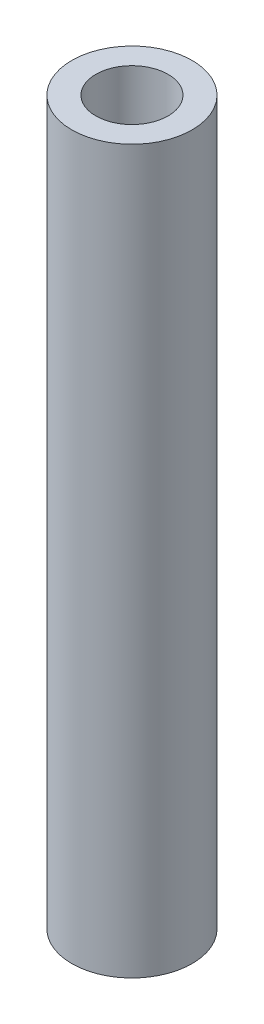
ISO-10303-21;
HEADER;
FILE_DESCRIPTION(('STEP AP214'),'2;1');
FILE_NAME('part.step','',(''),(''),'','','');
FILE_SCHEMA(('AUTOMOTIVE_DESIGN { 1 0 10303 214 1 1 1 1 }'));
ENDSEC;
DATA;
#1=APPLICATION_CONTEXT('core data for automotive mechanical design processes');
#2=APPLICATION_PROTOCOL_DEFINITION('international standard','automotive_design',2000,#1);
#3=PRODUCT_CONTEXT('',#1,'mechanical');
#4=PRODUCT('Part','Part','',(#3));
#5=PRODUCT_RELATED_PRODUCT_CATEGORY('part','',(#4));
#6=PRODUCT_DEFINITION_FORMATION('','',#4);
#7=PRODUCT_DEFINITION_CONTEXT('part definition',#1,'design');
#8=PRODUCT_DEFINITION('design','',#6,#7);
#9=PRODUCT_DEFINITION_SHAPE('','',#8);
#10=(LENGTH_UNIT() NAMED_UNIT(*) SI_UNIT(.MILLI.,.METRE.));
#11=(NAMED_UNIT(*) PLANE_ANGLE_UNIT() SI_UNIT($,.RADIAN.));
#12=(NAMED_UNIT(*) SI_UNIT($,.STERADIAN.) SOLID_ANGLE_UNIT());
#13=UNCERTAINTY_MEASURE_WITH_UNIT(LENGTH_MEASURE(1.E-05),#10,'distance_accuracy_value','');
#14=(GEOMETRIC_REPRESENTATION_CONTEXT(3) GLOBAL_UNCERTAINTY_ASSIGNED_CONTEXT((#13)) GLOBAL_UNIT_ASSIGNED_CONTEXT((#10,
#11,#12)) REPRESENTATION_CONTEXT('',''));
#15=CARTESIAN_POINT('',(0.,0.,0.));
#16=DIRECTION('',(0.,0.,1.));
#17=DIRECTION('',(1.,0.,0.));
#18=AXIS2_PLACEMENT_3D('',#15,#16,#17);
#19=CARTESIAN_POINT('',(0.,30.,0.));
#20=DIRECTION('',(0.,1.,0.));
#21=DIRECTION('',(0.,0.,1.));
#22=AXIS2_PLACEMENT_3D('',#19,#20,#21);
#23=PLANE('',#22);
#24=CARTESIAN_POINT('',(0.,30.,0.));
#25=DIRECTION('',(0.,1.,0.));
#26=DIRECTION('',(0.,0.,1.));
#27=AXIS2_PLACEMENT_3D('',#24,#25,#26);
#28=CIRCLE('',#27,2.5);
#29=CARTESIAN_POINT('',(0.,30.,2.5));
#30=VERTEX_POINT('',#29);
#31=EDGE_CURVE('E10',#30,#30,#28,.T.);
#32=ORIENTED_EDGE('',*,*,#31,.T.);
#33=EDGE_LOOP('',(#32));
#34=FACE_BOUND('',#33,.T.);
#35=CARTESIAN_POINT('',(0.,30.,0.));
#36=DIRECTION('',(0.,1.,0.));
#37=DIRECTION('',(0.,0.,1.));
#38=AXIS2_PLACEMENT_3D('',#35,#36,#37);
#39=CIRCLE('',#38,1.5);
#40=CARTESIAN_POINT('',(0.,30.,1.5));
#41=VERTEX_POINT('',#40);
#42=EDGE_CURVE('E44',#41,#41,#39,.T.);
#43=ORIENTED_EDGE('',*,*,#42,.F.);
#44=EDGE_LOOP('',(#43));
#45=FACE_BOUND('',#44,.T.);
#46=ADVANCED_FACE('F33',(#34,#45),#23,.T.);
#47=CARTESIAN_POINT('',(0.,0.,0.));
#48=DIRECTION('',(0.,1.,0.));
#49=DIRECTION('',(0.,0.,1.));
#50=AXIS2_PLACEMENT_3D('',#47,#48,#49);
#51=PLANE('',#50);
#52=CARTESIAN_POINT('',(0.,0.,0.));
#53=DIRECTION('',(0.,1.,0.));
#54=DIRECTION('',(0.,0.,1.));
#55=AXIS2_PLACEMENT_3D('',#52,#53,#54);
#56=CIRCLE('',#55,2.5);
#57=CARTESIAN_POINT('',(0.,0.,2.5));
#58=VERTEX_POINT('',#57);
#59=EDGE_CURVE('E37',#58,#58,#56,.T.);
#60=ORIENTED_EDGE('',*,*,#59,.F.);
#61=EDGE_LOOP('',(#60));
#62=FACE_BOUND('',#61,.T.);
#63=CARTESIAN_POINT('',(0.,0.,0.));
#64=DIRECTION('',(0.,1.,0.));
#65=DIRECTION('',(0.,0.,1.));
#66=AXIS2_PLACEMENT_3D('',#63,#64,#65);
#67=CIRCLE('',#66,1.5);
#68=CARTESIAN_POINT('',(0.,0.,1.5));
#69=VERTEX_POINT('',#68);
#70=EDGE_CURVE('E46',#69,#69,#67,.T.);
#71=ORIENTED_EDGE('',*,*,#70,.T.);
#72=EDGE_LOOP('',(#71));
#73=FACE_BOUND('',#72,.T.);
#74=ADVANCED_FACE('F56',(#62,#73),#51,.F.);
#75=CARTESIAN_POINT('',(0.,30.,0.));
#76=DIRECTION('',(0.,-1.,0.));
#77=DIRECTION('',(0.,0.,-1.));
#78=AXIS2_PLACEMENT_3D('',#75,#76,#77);
#79=CYLINDRICAL_SURFACE('',#78,2.5);
#80=ORIENTED_EDGE('',*,*,#31,.F.);
#81=EDGE_LOOP('',(#80));
#82=FACE_BOUND('',#81,.T.);
#83=ORIENTED_EDGE('',*,*,#59,.T.);
#84=EDGE_LOOP('',(#83));
#85=FACE_BOUND('',#84,.T.);
#86=ADVANCED_FACE('F35',(#82,#85),#79,.T.);
#87=CARTESIAN_POINT('',(0.,30.,0.));
#88=DIRECTION('',(0.,-1.,0.));
#89=DIRECTION('',(0.,0.,-1.));
#90=AXIS2_PLACEMENT_3D('',#87,#88,#89);
#91=CYLINDRICAL_SURFACE('',#90,1.5);
#92=ORIENTED_EDGE('',*,*,#42,.T.);
#93=EDGE_LOOP('',(#92));
#94=FACE_BOUND('',#93,.T.);
#95=ORIENTED_EDGE('',*,*,#70,.F.);
#96=EDGE_LOOP('',(#95));
#97=FACE_BOUND('',#96,.T.);
#98=ADVANCED_FACE('F52',(#94,#97),#91,.F.);
#99=CLOSED_SHELL('',(#46,#74,#86,#98));
#100=MANIFOLD_SOLID_BREP('B2',#99);
#101=ADVANCED_BREP_SHAPE_REPRESENTATION('',(#18,#100),#14);
#102=SHAPE_DEFINITION_REPRESENTATION(#9,#101);
ENDSEC;
END-ISO-10303-21;
